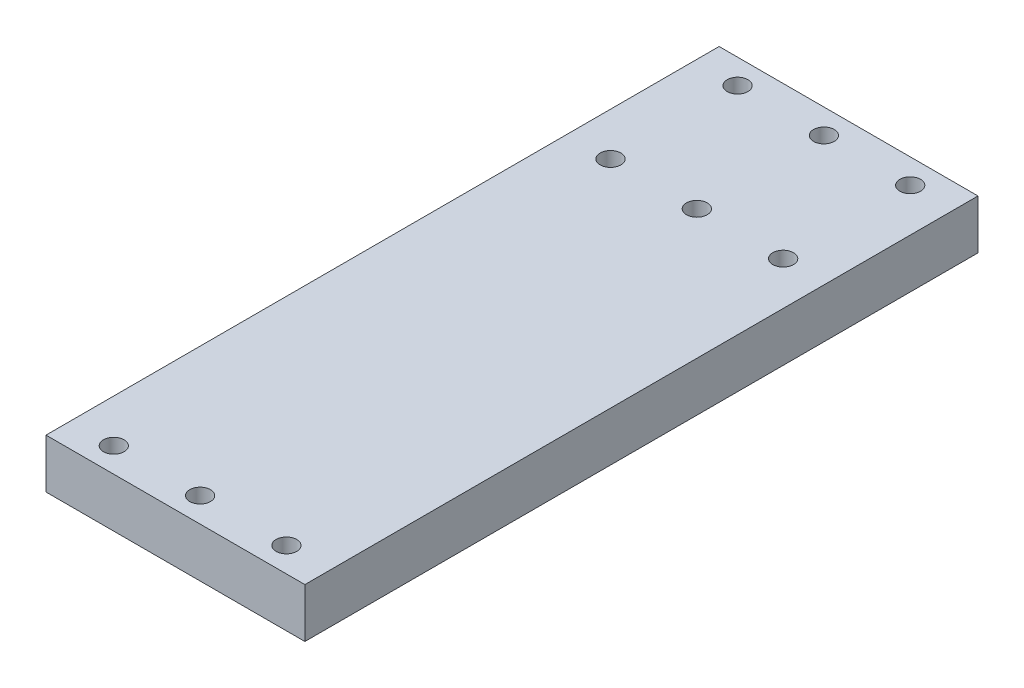
ISO-10303-21;
HEADER;
FILE_DESCRIPTION(('STEP AP214'),'2;1');
FILE_NAME('part.step','',(''),(''),'','','');
FILE_SCHEMA(('AUTOMOTIVE_DESIGN { 1 0 10303 214 1 1 1 1 }'));
ENDSEC;
DATA;
#1=APPLICATION_CONTEXT('core data for automotive mechanical design processes');
#2=APPLICATION_PROTOCOL_DEFINITION('international standard','automotive_design',2000,#1);
#3=PRODUCT_CONTEXT('',#1,'mechanical');
#4=PRODUCT('Part','Part','',(#3));
#5=PRODUCT_RELATED_PRODUCT_CATEGORY('part','',(#4));
#6=PRODUCT_DEFINITION_FORMATION('','',#4);
#7=PRODUCT_DEFINITION_CONTEXT('part definition',#1,'design');
#8=PRODUCT_DEFINITION('design','',#6,#7);
#9=PRODUCT_DEFINITION_SHAPE('','',#8);
#10=(LENGTH_UNIT() NAMED_UNIT(*) SI_UNIT(.MILLI.,.METRE.));
#11=(NAMED_UNIT(*) PLANE_ANGLE_UNIT() SI_UNIT($,.RADIAN.));
#12=(NAMED_UNIT(*) SI_UNIT($,.STERADIAN.) SOLID_ANGLE_UNIT());
#13=UNCERTAINTY_MEASURE_WITH_UNIT(LENGTH_MEASURE(1.E-05),#10,'distance_accuracy_value','');
#14=(GEOMETRIC_REPRESENTATION_CONTEXT(3) GLOBAL_UNCERTAINTY_ASSIGNED_CONTEXT((#13)) GLOBAL_UNIT_ASSIGNED_CONTEXT((#10,
#11,#12)) REPRESENTATION_CONTEXT('',''));
#15=CARTESIAN_POINT('',(0.,0.,0.));
#16=DIRECTION('',(0.,0.,1.));
#17=DIRECTION('',(1.,0.,0.));
#18=AXIS2_PLACEMENT_3D('',#15,#16,#17);
#19=CARTESIAN_POINT('',(25.,9.525,65.));
#20=DIRECTION('',(-1.,0.,0.));
#21=DIRECTION('',(0.,0.,1.));
#22=AXIS2_PLACEMENT_3D('',#19,#20,#21);
#23=PLANE('',#22);
#24=DIRECTION('',(0.,0.,-1.));
#25=VECTOR('',#24,1.);
#26=CARTESIAN_POINT('',(25.,0.,65.));
#27=LINE('',#26,#25);
#28=CARTESIAN_POINT('',(25.,0.,65.));
#29=VERTEX_POINT('',#28);
#30=CARTESIAN_POINT('',(25.,0.,-65.));
#31=VERTEX_POINT('',#30);
#32=EDGE_CURVE('E102',#29,#31,#27,.T.);
#33=ORIENTED_EDGE('',*,*,#32,.T.);
#34=DIRECTION('',(0.,-1.,0.));
#35=VECTOR('',#34,1.);
#36=CARTESIAN_POINT('',(25.,9.525,-65.));
#37=LINE('',#36,#35);
#38=CARTESIAN_POINT('',(25.,9.525,-65.));
#39=VERTEX_POINT('',#38);
#40=EDGE_CURVE('E11',#39,#31,#37,.T.);
#41=ORIENTED_EDGE('',*,*,#40,.F.);
#42=DIRECTION('',(0.,0.,-1.));
#43=VECTOR('',#42,1.);
#44=CARTESIAN_POINT('',(25.,9.525,65.));
#45=LINE('',#44,#43);
#46=CARTESIAN_POINT('',(25.,9.525,65.));
#47=VERTEX_POINT('',#46);
#48=EDGE_CURVE('E90',#47,#39,#45,.T.);
#49=ORIENTED_EDGE('',*,*,#48,.F.);
#50=DIRECTION('',(0.,-1.,0.));
#51=VECTOR('',#50,1.);
#52=CARTESIAN_POINT('',(25.,9.525,65.));
#53=LINE('',#52,#51);
#54=EDGE_CURVE('E98',#47,#29,#53,.T.);
#55=ORIENTED_EDGE('',*,*,#54,.T.);
#56=EDGE_LOOP('',(#33,#41,#49,#55));
#57=FACE_BOUND('',#56,.T.);
#58=ADVANCED_FACE('F39',(#57),#23,.F.);
#59=CARTESIAN_POINT('',(-25.,9.525,-65.));
#60=DIRECTION('',(0.,0.,1.));
#61=DIRECTION('',(1.,0.,0.));
#62=AXIS2_PLACEMENT_3D('',#59,#60,#61);
#63=PLANE('',#62);
#64=DIRECTION('',(-1.,0.,0.));
#65=VECTOR('',#64,1.);
#66=CARTESIAN_POINT('',(-25.,0.,-65.));
#67=LINE('',#66,#65);
#68=CARTESIAN_POINT('',(-25.,0.,-65.));
#69=VERTEX_POINT('',#68);
#70=EDGE_CURVE('E94',#31,#69,#67,.T.);
#71=ORIENTED_EDGE('',*,*,#70,.T.);
#72=DIRECTION('',(0.,-1.,0.));
#73=VECTOR('',#72,1.);
#74=CARTESIAN_POINT('',(-25.,9.525,-65.));
#75=LINE('',#74,#73);
#76=CARTESIAN_POINT('',(-25.,9.525,-65.));
#77=VERTEX_POINT('',#76);
#78=EDGE_CURVE('E47',#77,#69,#75,.T.);
#79=ORIENTED_EDGE('',*,*,#78,.F.);
#80=DIRECTION('',(-1.,0.,0.));
#81=VECTOR('',#80,1.);
#82=CARTESIAN_POINT('',(-25.,9.525,-65.));
#83=LINE('',#82,#81);
#84=EDGE_CURVE('E85',#39,#77,#83,.T.);
#85=ORIENTED_EDGE('',*,*,#84,.F.);
#86=ORIENTED_EDGE('',*,*,#40,.T.);
#87=EDGE_LOOP('',(#71,#79,#85,#86));
#88=FACE_BOUND('',#87,.T.);
#89=ADVANCED_FACE('F93',(#88),#63,.F.);
#90=CARTESIAN_POINT('',(-25.,9.525,65.));
#91=DIRECTION('',(1.,0.,0.));
#92=DIRECTION('',(0.,0.,-1.));
#93=AXIS2_PLACEMENT_3D('',#90,#91,#92);
#94=PLANE('',#93);
#95=DIRECTION('',(0.,0.,1.));
#96=VECTOR('',#95,1.);
#97=CARTESIAN_POINT('',(-25.,0.,65.));
#98=LINE('',#97,#96);
#99=CARTESIAN_POINT('',(-25.,0.,65.));
#100=VERTEX_POINT('',#99);
#101=EDGE_CURVE('E72',#69,#100,#98,.T.);
#102=ORIENTED_EDGE('',*,*,#101,.T.);
#103=DIRECTION('',(0.,-1.,0.));
#104=VECTOR('',#103,1.);
#105=CARTESIAN_POINT('',(-25.,9.525,65.));
#106=LINE('',#105,#104);
#107=CARTESIAN_POINT('',(-25.,9.525,65.));
#108=VERTEX_POINT('',#107);
#109=EDGE_CURVE('E95',#108,#100,#106,.T.);
#110=ORIENTED_EDGE('',*,*,#109,.F.);
#111=DIRECTION('',(0.,0.,1.));
#112=VECTOR('',#111,1.);
#113=CARTESIAN_POINT('',(-25.,9.525,65.));
#114=LINE('',#113,#112);
#115=EDGE_CURVE('E88',#77,#108,#114,.T.);
#116=ORIENTED_EDGE('',*,*,#115,.F.);
#117=ORIENTED_EDGE('',*,*,#78,.T.);
#118=EDGE_LOOP('',(#102,#110,#116,#117));
#119=FACE_BOUND('',#118,.T.);
#120=ADVANCED_FACE('F96',(#119),#94,.F.);
#121=CARTESIAN_POINT('',(-25.,9.525,65.));
#122=DIRECTION('',(0.,0.,-1.));
#123=DIRECTION('',(-1.,0.,0.));
#124=AXIS2_PLACEMENT_3D('',#121,#122,#123);
#125=PLANE('',#124);
#126=DIRECTION('',(1.,0.,0.));
#127=VECTOR('',#126,1.);
#128=CARTESIAN_POINT('',(-25.,0.,65.));
#129=LINE('',#128,#127);
#130=EDGE_CURVE('E78',#100,#29,#129,.T.);
#131=ORIENTED_EDGE('',*,*,#130,.T.);
#132=ORIENTED_EDGE('',*,*,#54,.F.);
#133=DIRECTION('',(1.,0.,0.));
#134=VECTOR('',#133,1.);
#135=CARTESIAN_POINT('',(-25.,9.525,65.));
#136=LINE('',#135,#134);
#137=EDGE_CURVE('E55',#108,#47,#136,.T.);
#138=ORIENTED_EDGE('',*,*,#137,.F.);
#139=ORIENTED_EDGE('',*,*,#109,.T.);
#140=EDGE_LOOP('',(#131,#132,#138,#139));
#141=FACE_BOUND('',#140,.T.);
#142=ADVANCED_FACE('F110',(#141),#125,.F.);
#143=CARTESIAN_POINT('',(0.,9.525,0.));
#144=DIRECTION('',(0.,-1.,0.));
#145=DIRECTION('',(0.,0.,-1.));
#146=AXIS2_PLACEMENT_3D('',#143,#144,#145);
#147=PLANE('',#146);
#148=CARTESIAN_POINT('',(-16.67,9.525,60.2375));
#149=DIRECTION('',(0.,1.,0.));
#150=DIRECTION('',(0.,0.,1.));
#151=AXIS2_PLACEMENT_3D('',#148,#149,#150);
#152=CIRCLE('',#151,1.99999999999999);
#153=CARTESIAN_POINT('',(-16.67,9.525,62.2375));
#154=VERTEX_POINT('',#153);
#155=EDGE_CURVE('E166',#154,#154,#152,.T.);
#156=ORIENTED_EDGE('',*,*,#155,.F.);
#157=EDGE_LOOP('',(#156));
#158=FACE_BOUND('',#157,.T.);
#159=CARTESIAN_POINT('',(0.,9.525,60.2375));
#160=DIRECTION('',(0.,1.,0.));
#161=DIRECTION('',(0.,0.,1.));
#162=AXIS2_PLACEMENT_3D('',#159,#160,#161);
#163=CIRCLE('',#162,1.99999999999999);
#164=CARTESIAN_POINT('',(0.,9.525,62.2375));
#165=VERTEX_POINT('',#164);
#166=EDGE_CURVE('E160',#165,#165,#163,.T.);
#167=ORIENTED_EDGE('',*,*,#166,.F.);
#168=EDGE_LOOP('',(#167));
#169=FACE_BOUND('',#168,.T.);
#170=CARTESIAN_POINT('',(16.67,9.525,60.2375));
#171=DIRECTION('',(0.,1.,0.));
#172=DIRECTION('',(0.,0.,1.));
#173=AXIS2_PLACEMENT_3D('',#170,#171,#172);
#174=CIRCLE('',#173,1.99999999999999);
#175=CARTESIAN_POINT('',(16.67,9.525,62.2375));
#176=VERTEX_POINT('',#175);
#177=EDGE_CURVE('E154',#176,#176,#174,.T.);
#178=ORIENTED_EDGE('',*,*,#177,.F.);
#179=EDGE_LOOP('',(#178));
#180=FACE_BOUND('',#179,.T.);
#181=CARTESIAN_POINT('',(-16.67,9.525,-35.7000000000004));
#182=DIRECTION('',(0.,1.,0.));
#183=DIRECTION('',(0.,0.,1.));
#184=AXIS2_PLACEMENT_3D('',#181,#182,#183);
#185=CIRCLE('',#184,1.99999999999999);
#186=CARTESIAN_POINT('',(-16.67,9.525,-33.7000000000004));
#187=VERTEX_POINT('',#186);
#188=EDGE_CURVE('E148',#187,#187,#185,.T.);
#189=ORIENTED_EDGE('',*,*,#188,.F.);
#190=EDGE_LOOP('',(#189));
#191=FACE_BOUND('',#190,.T.);
#192=CARTESIAN_POINT('',(0.,9.525,-35.7000000000004));
#193=DIRECTION('',(0.,1.,0.));
#194=DIRECTION('',(0.,0.,1.));
#195=AXIS2_PLACEMENT_3D('',#192,#193,#194);
#196=CIRCLE('',#195,1.99999999999999);
#197=CARTESIAN_POINT('',(0.,9.525,-33.7000000000004));
#198=VERTEX_POINT('',#197);
#199=EDGE_CURVE('E142',#198,#198,#196,.T.);
#200=ORIENTED_EDGE('',*,*,#199,.F.);
#201=EDGE_LOOP('',(#200));
#202=FACE_BOUND('',#201,.T.);
#203=CARTESIAN_POINT('',(16.67,9.525,-35.7000000000004));
#204=DIRECTION('',(0.,1.,0.));
#205=DIRECTION('',(0.,0.,1.));
#206=AXIS2_PLACEMENT_3D('',#203,#204,#205);
#207=CIRCLE('',#206,1.99999999999999);
#208=CARTESIAN_POINT('',(16.67,9.525,-33.7000000000004));
#209=VERTEX_POINT('',#208);
#210=EDGE_CURVE('E136',#209,#209,#207,.T.);
#211=ORIENTED_EDGE('',*,*,#210,.F.);
#212=EDGE_LOOP('',(#211));
#213=FACE_BOUND('',#212,.T.);
#214=CARTESIAN_POINT('',(-16.6699999999991,9.525,-60.2374999999997));
#215=DIRECTION('',(0.,1.,0.));
#216=DIRECTION('',(0.,0.,1.));
#217=AXIS2_PLACEMENT_3D('',#214,#215,#216);
#218=CIRCLE('',#217,1.99999999999999);
#219=CARTESIAN_POINT('',(-16.6699999999991,9.525,-58.2374999999997));
#220=VERTEX_POINT('',#219);
#221=EDGE_CURVE('E130',#220,#220,#218,.T.);
#222=ORIENTED_EDGE('',*,*,#221,.F.);
#223=EDGE_LOOP('',(#222));
#224=FACE_BOUND('',#223,.T.);
#225=CARTESIAN_POINT('',(9.30375837836077E-13,9.525,-60.2374999999997));
#226=DIRECTION('',(0.,1.,0.));
#227=DIRECTION('',(0.,0.,1.));
#228=AXIS2_PLACEMENT_3D('',#225,#226,#227);
#229=CIRCLE('',#228,1.99999999999999);
#230=CARTESIAN_POINT('',(9.30375837836077E-13,9.525,-58.2374999999997));
#231=VERTEX_POINT('',#230);
#232=EDGE_CURVE('E124',#231,#231,#229,.T.);
#233=ORIENTED_EDGE('',*,*,#232,.F.);
#234=EDGE_LOOP('',(#233));
#235=FACE_BOUND('',#234,.T.);
#236=CARTESIAN_POINT('',(16.6700000000009,9.525,-60.2374999999997));
#237=DIRECTION('',(0.,1.,0.));
#238=DIRECTION('',(0.,0.,1.));
#239=AXIS2_PLACEMENT_3D('',#236,#237,#238);
#240=CIRCLE('',#239,1.99999999999999);
#241=CARTESIAN_POINT('',(16.6700000000009,9.525,-58.2374999999997));
#242=VERTEX_POINT('',#241);
#243=EDGE_CURVE('E118',#242,#242,#240,.T.);
#244=ORIENTED_EDGE('',*,*,#243,.F.);
#245=EDGE_LOOP('',(#244));
#246=FACE_BOUND('',#245,.T.);
#247=ORIENTED_EDGE('',*,*,#48,.T.);
#248=ORIENTED_EDGE('',*,*,#84,.T.);
#249=ORIENTED_EDGE('',*,*,#115,.T.);
#250=ORIENTED_EDGE('',*,*,#137,.T.);
#251=EDGE_LOOP('',(#247,#248,#249,#250));
#252=FACE_BOUND('',#251,.T.);
#253=ADVANCED_FACE('F86',(#158,#169,#180,#191,#202,#213,#224,#235,#246,#252),#147,.F.);
#254=CARTESIAN_POINT('',(0.,0.,0.));
#255=DIRECTION('',(0.,-1.,0.));
#256=DIRECTION('',(0.,0.,-1.));
#257=AXIS2_PLACEMENT_3D('',#254,#255,#256);
#258=PLANE('',#257);
#259=CARTESIAN_POINT('',(-16.67,0.,60.2375));
#260=DIRECTION('',(0.,1.,0.));
#261=DIRECTION('',(0.,0.,1.));
#262=AXIS2_PLACEMENT_3D('',#259,#260,#261);
#263=CIRCLE('',#262,2.);
#264=CARTESIAN_POINT('',(-16.67,0.,62.2375));
#265=VERTEX_POINT('',#264);
#266=EDGE_CURVE('E163',#265,#265,#263,.T.);
#267=ORIENTED_EDGE('',*,*,#266,.T.);
#268=EDGE_LOOP('',(#267));
#269=FACE_BOUND('',#268,.T.);
#270=CARTESIAN_POINT('',(0.,0.,60.2375));
#271=DIRECTION('',(0.,1.,0.));
#272=DIRECTION('',(0.,0.,1.));
#273=AXIS2_PLACEMENT_3D('',#270,#271,#272);
#274=CIRCLE('',#273,2.);
#275=CARTESIAN_POINT('',(0.,0.,62.2375));
#276=VERTEX_POINT('',#275);
#277=EDGE_CURVE('E157',#276,#276,#274,.T.);
#278=ORIENTED_EDGE('',*,*,#277,.T.);
#279=EDGE_LOOP('',(#278));
#280=FACE_BOUND('',#279,.T.);
#281=CARTESIAN_POINT('',(16.67,0.,60.2375));
#282=DIRECTION('',(0.,1.,0.));
#283=DIRECTION('',(0.,0.,1.));
#284=AXIS2_PLACEMENT_3D('',#281,#282,#283);
#285=CIRCLE('',#284,2.);
#286=CARTESIAN_POINT('',(16.67,0.,62.2375));
#287=VERTEX_POINT('',#286);
#288=EDGE_CURVE('E151',#287,#287,#285,.T.);
#289=ORIENTED_EDGE('',*,*,#288,.T.);
#290=EDGE_LOOP('',(#289));
#291=FACE_BOUND('',#290,.T.);
#292=CARTESIAN_POINT('',(-16.67,0.,-35.7000000000004));
#293=DIRECTION('',(0.,1.,0.));
#294=DIRECTION('',(0.,0.,1.));
#295=AXIS2_PLACEMENT_3D('',#292,#293,#294);
#296=CIRCLE('',#295,2.);
#297=CARTESIAN_POINT('',(-16.67,0.,-33.7000000000004));
#298=VERTEX_POINT('',#297);
#299=EDGE_CURVE('E145',#298,#298,#296,.T.);
#300=ORIENTED_EDGE('',*,*,#299,.T.);
#301=EDGE_LOOP('',(#300));
#302=FACE_BOUND('',#301,.T.);
#303=CARTESIAN_POINT('',(0.,0.,-35.7000000000004));
#304=DIRECTION('',(0.,1.,0.));
#305=DIRECTION('',(0.,0.,1.));
#306=AXIS2_PLACEMENT_3D('',#303,#304,#305);
#307=CIRCLE('',#306,2.);
#308=CARTESIAN_POINT('',(0.,0.,-33.7000000000004));
#309=VERTEX_POINT('',#308);
#310=EDGE_CURVE('E139',#309,#309,#307,.T.);
#311=ORIENTED_EDGE('',*,*,#310,.T.);
#312=EDGE_LOOP('',(#311));
#313=FACE_BOUND('',#312,.T.);
#314=CARTESIAN_POINT('',(16.67,0.,-35.7000000000004));
#315=DIRECTION('',(0.,1.,0.));
#316=DIRECTION('',(0.,0.,1.));
#317=AXIS2_PLACEMENT_3D('',#314,#315,#316);
#318=CIRCLE('',#317,2.);
#319=CARTESIAN_POINT('',(16.67,0.,-33.7000000000004));
#320=VERTEX_POINT('',#319);
#321=EDGE_CURVE('E133',#320,#320,#318,.T.);
#322=ORIENTED_EDGE('',*,*,#321,.T.);
#323=EDGE_LOOP('',(#322));
#324=FACE_BOUND('',#323,.T.);
#325=CARTESIAN_POINT('',(-16.6699999999991,0.,-60.2374999999997));
#326=DIRECTION('',(0.,1.,0.));
#327=DIRECTION('',(0.,0.,1.));
#328=AXIS2_PLACEMENT_3D('',#325,#326,#327);
#329=CIRCLE('',#328,2.);
#330=CARTESIAN_POINT('',(-16.6699999999991,0.,-58.2374999999997));
#331=VERTEX_POINT('',#330);
#332=EDGE_CURVE('E127',#331,#331,#329,.T.);
#333=ORIENTED_EDGE('',*,*,#332,.T.);
#334=EDGE_LOOP('',(#333));
#335=FACE_BOUND('',#334,.T.);
#336=CARTESIAN_POINT('',(9.30375837836077E-13,0.,-60.2374999999997));
#337=DIRECTION('',(0.,1.,0.));
#338=DIRECTION('',(0.,0.,1.));
#339=AXIS2_PLACEMENT_3D('',#336,#337,#338);
#340=CIRCLE('',#339,2.);
#341=CARTESIAN_POINT('',(9.30375837836077E-13,0.,-58.2374999999997));
#342=VERTEX_POINT('',#341);
#343=EDGE_CURVE('E121',#342,#342,#340,.T.);
#344=ORIENTED_EDGE('',*,*,#343,.T.);
#345=EDGE_LOOP('',(#344));
#346=FACE_BOUND('',#345,.T.);
#347=CARTESIAN_POINT('',(16.6700000000009,0.,-60.2374999999997));
#348=DIRECTION('',(0.,1.,0.));
#349=DIRECTION('',(0.,0.,1.));
#350=AXIS2_PLACEMENT_3D('',#347,#348,#349);
#351=CIRCLE('',#350,2.);
#352=CARTESIAN_POINT('',(16.6700000000009,0.,-58.2374999999997));
#353=VERTEX_POINT('',#352);
#354=EDGE_CURVE('E105',#353,#353,#351,.T.);
#355=ORIENTED_EDGE('',*,*,#354,.T.);
#356=EDGE_LOOP('',(#355));
#357=FACE_BOUND('',#356,.T.);
#358=ORIENTED_EDGE('',*,*,#32,.F.);
#359=ORIENTED_EDGE('',*,*,#130,.F.);
#360=ORIENTED_EDGE('',*,*,#101,.F.);
#361=ORIENTED_EDGE('',*,*,#70,.F.);
#362=EDGE_LOOP('',(#358,#359,#360,#361));
#363=FACE_BOUND('',#362,.T.);
#364=ADVANCED_FACE('F113',(#269,#280,#291,#302,#313,#324,#335,#346,#357,#363),#258,.T.);
#365=CARTESIAN_POINT('',(16.6700000000009,9.525,-60.2374999999997));
#366=DIRECTION('',(0.,1.,0.));
#367=DIRECTION('',(0.,0.,1.));
#368=AXIS2_PLACEMENT_3D('',#365,#366,#367);
#369=CYLINDRICAL_SURFACE('',#368,1.99999999999999);
#370=ORIENTED_EDGE('',*,*,#354,.F.);
#371=EDGE_LOOP('',(#370));
#372=FACE_BOUND('',#371,.T.);
#373=ORIENTED_EDGE('',*,*,#243,.T.);
#374=EDGE_LOOP('',(#373));
#375=FACE_BOUND('',#374,.T.);
#376=ADVANCED_FACE('F191',(#372,#375),#369,.F.);
#377=CARTESIAN_POINT('',(9.30375837836077E-13,9.525,-60.2374999999997));
#378=DIRECTION('',(0.,1.,0.));
#379=DIRECTION('',(0.,0.,1.));
#380=AXIS2_PLACEMENT_3D('',#377,#378,#379);
#381=CYLINDRICAL_SURFACE('',#380,1.99999999999999);
#382=ORIENTED_EDGE('',*,*,#343,.F.);
#383=EDGE_LOOP('',(#382));
#384=FACE_BOUND('',#383,.T.);
#385=ORIENTED_EDGE('',*,*,#232,.T.);
#386=EDGE_LOOP('',(#385));
#387=FACE_BOUND('',#386,.T.);
#388=ADVANCED_FACE('F193',(#384,#387),#381,.F.);
#389=CARTESIAN_POINT('',(-16.6699999999991,9.525,-60.2374999999997));
#390=DIRECTION('',(0.,1.,0.));
#391=DIRECTION('',(0.,0.,1.));
#392=AXIS2_PLACEMENT_3D('',#389,#390,#391);
#393=CYLINDRICAL_SURFACE('',#392,1.99999999999999);
#394=ORIENTED_EDGE('',*,*,#332,.F.);
#395=EDGE_LOOP('',(#394));
#396=FACE_BOUND('',#395,.T.);
#397=ORIENTED_EDGE('',*,*,#221,.T.);
#398=EDGE_LOOP('',(#397));
#399=FACE_BOUND('',#398,.T.);
#400=ADVANCED_FACE('F200',(#396,#399),#393,.F.);
#401=CARTESIAN_POINT('',(16.67,9.525,-35.7000000000004));
#402=DIRECTION('',(0.,1.,0.));
#403=DIRECTION('',(0.,0.,1.));
#404=AXIS2_PLACEMENT_3D('',#401,#402,#403);
#405=CYLINDRICAL_SURFACE('',#404,1.99999999999999);
#406=ORIENTED_EDGE('',*,*,#321,.F.);
#407=EDGE_LOOP('',(#406));
#408=FACE_BOUND('',#407,.T.);
#409=ORIENTED_EDGE('',*,*,#210,.T.);
#410=EDGE_LOOP('',(#409));
#411=FACE_BOUND('',#410,.T.);
#412=ADVANCED_FACE('F250',(#408,#411),#405,.F.);
#413=CARTESIAN_POINT('',(0.,9.525,-35.7000000000004));
#414=DIRECTION('',(0.,1.,0.));
#415=DIRECTION('',(0.,0.,1.));
#416=AXIS2_PLACEMENT_3D('',#413,#414,#415);
#417=CYLINDRICAL_SURFACE('',#416,1.99999999999999);
#418=ORIENTED_EDGE('',*,*,#310,.F.);
#419=EDGE_LOOP('',(#418));
#420=FACE_BOUND('',#419,.T.);
#421=ORIENTED_EDGE('',*,*,#199,.T.);
#422=EDGE_LOOP('',(#421));
#423=FACE_BOUND('',#422,.T.);
#424=ADVANCED_FACE('F260',(#420,#423),#417,.F.);
#425=CARTESIAN_POINT('',(-16.67,9.525,-35.7000000000004));
#426=DIRECTION('',(0.,1.,0.));
#427=DIRECTION('',(0.,0.,1.));
#428=AXIS2_PLACEMENT_3D('',#425,#426,#427);
#429=CYLINDRICAL_SURFACE('',#428,1.99999999999999);
#430=ORIENTED_EDGE('',*,*,#299,.F.);
#431=EDGE_LOOP('',(#430));
#432=FACE_BOUND('',#431,.T.);
#433=ORIENTED_EDGE('',*,*,#188,.T.);
#434=EDGE_LOOP('',(#433));
#435=FACE_BOUND('',#434,.T.);
#436=ADVANCED_FACE('F270',(#432,#435),#429,.F.);
#437=CARTESIAN_POINT('',(16.67,9.525,60.2375));
#438=DIRECTION('',(0.,1.,0.));
#439=DIRECTION('',(0.,0.,1.));
#440=AXIS2_PLACEMENT_3D('',#437,#438,#439);
#441=CYLINDRICAL_SURFACE('',#440,1.99999999999999);
#442=ORIENTED_EDGE('',*,*,#288,.F.);
#443=EDGE_LOOP('',(#442));
#444=FACE_BOUND('',#443,.T.);
#445=ORIENTED_EDGE('',*,*,#177,.T.);
#446=EDGE_LOOP('',(#445));
#447=FACE_BOUND('',#446,.T.);
#448=ADVANCED_FACE('F280',(#444,#447),#441,.F.);
#449=CARTESIAN_POINT('',(0.,9.525,60.2375));
#450=DIRECTION('',(0.,1.,0.));
#451=DIRECTION('',(0.,0.,1.));
#452=AXIS2_PLACEMENT_3D('',#449,#450,#451);
#453=CYLINDRICAL_SURFACE('',#452,1.99999999999999);
#454=ORIENTED_EDGE('',*,*,#277,.F.);
#455=EDGE_LOOP('',(#454));
#456=FACE_BOUND('',#455,.T.);
#457=ORIENTED_EDGE('',*,*,#166,.T.);
#458=EDGE_LOOP('',(#457));
#459=FACE_BOUND('',#458,.T.);
#460=ADVANCED_FACE('F290',(#456,#459),#453,.F.);
#461=CARTESIAN_POINT('',(-16.67,9.525,60.2375));
#462=DIRECTION('',(0.,1.,0.));
#463=DIRECTION('',(0.,0.,1.));
#464=AXIS2_PLACEMENT_3D('',#461,#462,#463);
#465=CYLINDRICAL_SURFACE('',#464,1.99999999999999);
#466=ORIENTED_EDGE('',*,*,#266,.F.);
#467=EDGE_LOOP('',(#466));
#468=FACE_BOUND('',#467,.T.);
#469=ORIENTED_EDGE('',*,*,#155,.T.);
#470=EDGE_LOOP('',(#469));
#471=FACE_BOUND('',#470,.T.);
#472=ADVANCED_FACE('F170',(#468,#471),#465,.F.);
#473=CLOSED_SHELL('',(#58,#89,#120,#142,#253,#364,#376,#388,#400,#412,#424,#436,#448,#460,#472));
#474=MANIFOLD_SOLID_BREP('B2',#473);
#475=ADVANCED_BREP_SHAPE_REPRESENTATION('',(#18,#474),#14);
#476=SHAPE_DEFINITION_REPRESENTATION(#9,#475);
ENDSEC;
END-ISO-10303-21;
